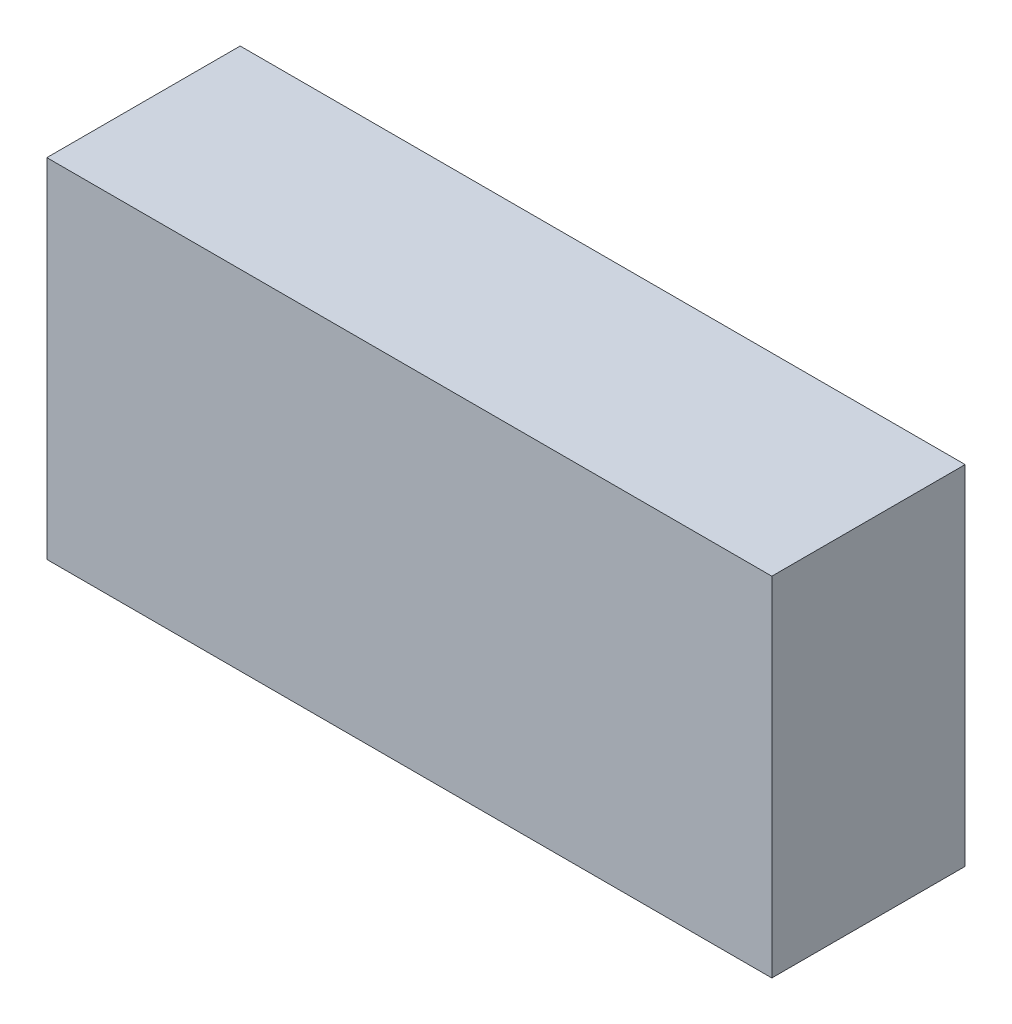
ISO-10303-21;
HEADER;
FILE_DESCRIPTION(('STEP AP214'),'2;1');
FILE_NAME('part.step','',(''),(''),'','','');
FILE_SCHEMA(('AUTOMOTIVE_DESIGN { 1 0 10303 214 1 1 1 1 }'));
ENDSEC;
DATA;
#1=APPLICATION_CONTEXT('core data for automotive mechanical design processes');
#2=APPLICATION_PROTOCOL_DEFINITION('international standard','automotive_design',2000,#1);
#3=PRODUCT_CONTEXT('',#1,'mechanical');
#4=PRODUCT('Part','Part','',(#3));
#5=PRODUCT_RELATED_PRODUCT_CATEGORY('part','',(#4));
#6=PRODUCT_DEFINITION_FORMATION('','',#4);
#7=PRODUCT_DEFINITION_CONTEXT('part definition',#1,'design');
#8=PRODUCT_DEFINITION('design','',#6,#7);
#9=PRODUCT_DEFINITION_SHAPE('','',#8);
#10=(LENGTH_UNIT() NAMED_UNIT(*) SI_UNIT(.MILLI.,.METRE.));
#11=(NAMED_UNIT(*) PLANE_ANGLE_UNIT() SI_UNIT($,.RADIAN.));
#12=(NAMED_UNIT(*) SI_UNIT($,.STERADIAN.) SOLID_ANGLE_UNIT());
#13=UNCERTAINTY_MEASURE_WITH_UNIT(LENGTH_MEASURE(1.E-05),#10,'distance_accuracy_value','');
#14=(GEOMETRIC_REPRESENTATION_CONTEXT(3) GLOBAL_UNCERTAINTY_ASSIGNED_CONTEXT((#13)) GLOBAL_UNIT_ASSIGNED_CONTEXT((#10,
#11,#12)) REPRESENTATION_CONTEXT('',''));
#15=CARTESIAN_POINT('',(0.,0.,0.));
#16=DIRECTION('',(0.,0.,1.));
#17=DIRECTION('',(1.,0.,0.));
#18=AXIS2_PLACEMENT_3D('',#15,#16,#17);
#19=CARTESIAN_POINT('',(-1.87500006,0.90000074,1.00000054));
#20=DIRECTION('',(0.,0.,-1.));
#21=DIRECTION('',(-1.,0.,0.));
#22=AXIS2_PLACEMENT_3D('',#19,#20,#21);
#23=PLANE('',#22);
#24=DIRECTION('',(1.,0.,0.));
#25=VECTOR('',#24,1.);
#26=CARTESIAN_POINT('',(-1.87500006,-0.8999982,1.00000054));
#27=LINE('',#26,#25);
#28=CARTESIAN_POINT('',(-1.87500006,-0.8999982,1.00000054));
#29=VERTEX_POINT('',#28);
#30=CARTESIAN_POINT('',(1.87500006,-0.8999982,1.00000054));
#31=VERTEX_POINT('',#30);
#32=EDGE_CURVE('E54',#29,#31,#27,.T.);
#33=ORIENTED_EDGE('',*,*,#32,.T.);
#34=DIRECTION('',(0.,1.,0.));
#35=VECTOR('',#34,1.);
#36=CARTESIAN_POINT('',(1.87500006,-0.8999982,1.00000054));
#37=LINE('',#36,#35);
#38=CARTESIAN_POINT('',(1.87500006,0.90000074,1.00000054));
#39=VERTEX_POINT('',#38);
#40=EDGE_CURVE('E56',#31,#39,#37,.T.);
#41=ORIENTED_EDGE('',*,*,#40,.T.);
#42=DIRECTION('',(1.,0.,0.));
#43=VECTOR('',#42,1.);
#44=CARTESIAN_POINT('',(1.87500006,0.90000074,1.00000054));
#45=LINE('',#44,#43);
#46=CARTESIAN_POINT('',(-1.87500006,0.90000074,1.00000054));
#47=VERTEX_POINT('',#46);
#48=EDGE_CURVE('E19',#39,#47,#45,.F.);
#49=ORIENTED_EDGE('',*,*,#48,.T.);
#50=DIRECTION('',(0.,1.,0.));
#51=VECTOR('',#50,1.);
#52=CARTESIAN_POINT('',(-1.87500006,0.90000074,1.00000054));
#53=LINE('',#52,#51);
#54=EDGE_CURVE('E79',#47,#29,#53,.F.);
#55=ORIENTED_EDGE('',*,*,#54,.T.);
#56=EDGE_LOOP('',(#33,#41,#49,#55));
#57=FACE_BOUND('',#56,.T.);
#58=ADVANCED_FACE('F16',(#57),#23,.F.);
#59=CARTESIAN_POINT('',(1.87500006,0.90000074,0.));
#60=DIRECTION('',(0.,-1.,0.));
#61=DIRECTION('',(0.,0.,-1.));
#62=AXIS2_PLACEMENT_3D('',#59,#60,#61);
#63=PLANE('',#62);
#64=DIRECTION('',(0.,0.,-1.));
#65=VECTOR('',#64,1.);
#66=CARTESIAN_POINT('',(-1.87500006,0.90000074,0.));
#67=LINE('',#66,#65);
#68=CARTESIAN_POINT('',(-1.87500006,0.90000074,0.));
#69=VERTEX_POINT('',#68);
#70=EDGE_CURVE('E67',#69,#47,#67,.F.);
#71=ORIENTED_EDGE('',*,*,#70,.T.);
#72=ORIENTED_EDGE('',*,*,#48,.F.);
#73=DIRECTION('',(0.,0.,1.));
#74=VECTOR('',#73,1.);
#75=CARTESIAN_POINT('',(1.87500006,0.90000074,0.));
#76=LINE('',#75,#74);
#77=CARTESIAN_POINT('',(1.87500006,0.90000074,0.));
#78=VERTEX_POINT('',#77);
#79=EDGE_CURVE('E62',#39,#78,#76,.F.);
#80=ORIENTED_EDGE('',*,*,#79,.T.);
#81=DIRECTION('',(-1.,0.,0.));
#82=VECTOR('',#81,1.);
#83=CARTESIAN_POINT('',(-1.87500006,0.90000074,0.));
#84=LINE('',#83,#82);
#85=EDGE_CURVE('E82',#69,#78,#84,.F.);
#86=ORIENTED_EDGE('',*,*,#85,.F.);
#87=EDGE_LOOP('',(#71,#72,#80,#86));
#88=FACE_BOUND('',#87,.T.);
#89=ADVANCED_FACE('F64',(#88),#63,.F.);
#90=CARTESIAN_POINT('',(1.87500006,-0.8999982,0.));
#91=DIRECTION('',(-1.,0.,0.));
#92=DIRECTION('',(0.,0.,1.));
#93=AXIS2_PLACEMENT_3D('',#90,#91,#92);
#94=PLANE('',#93);
#95=ORIENTED_EDGE('',*,*,#79,.F.);
#96=ORIENTED_EDGE('',*,*,#40,.F.);
#97=DIRECTION('',(0.,0.,1.));
#98=VECTOR('',#97,1.);
#99=CARTESIAN_POINT('',(1.87500006,-0.8999982,0.));
#100=LINE('',#99,#98);
#101=CARTESIAN_POINT('',(1.87500006,-0.8999982,0.));
#102=VERTEX_POINT('',#101);
#103=EDGE_CURVE('E74',#31,#102,#100,.F.);
#104=ORIENTED_EDGE('',*,*,#103,.T.);
#105=DIRECTION('',(0.,1.,0.));
#106=VECTOR('',#105,1.);
#107=CARTESIAN_POINT('',(1.87500006,0.90000074,0.));
#108=LINE('',#107,#106);
#109=EDGE_CURVE('E71',#78,#102,#108,.F.);
#110=ORIENTED_EDGE('',*,*,#109,.F.);
#111=EDGE_LOOP('',(#95,#96,#104,#110));
#112=FACE_BOUND('',#111,.T.);
#113=ADVANCED_FACE('F69',(#112),#94,.F.);
#114=CARTESIAN_POINT('',(-1.87500006,-0.8999982,0.));
#115=DIRECTION('',(0.,1.,0.));
#116=DIRECTION('',(0.,0.,1.));
#117=AXIS2_PLACEMENT_3D('',#114,#115,#116);
#118=PLANE('',#117);
#119=ORIENTED_EDGE('',*,*,#103,.F.);
#120=ORIENTED_EDGE('',*,*,#32,.F.);
#121=DIRECTION('',(0.,0.,-1.));
#122=VECTOR('',#121,1.);
#123=CARTESIAN_POINT('',(-1.87500006,-0.8999982,0.));
#124=LINE('',#123,#122);
#125=CARTESIAN_POINT('',(-1.87500006,-0.8999982,0.));
#126=VERTEX_POINT('',#125);
#127=EDGE_CURVE('E34',#29,#126,#124,.T.);
#128=ORIENTED_EDGE('',*,*,#127,.T.);
#129=DIRECTION('',(-1.,0.,0.));
#130=VECTOR('',#129,1.);
#131=CARTESIAN_POINT('',(-1.87500006,-0.8999982,0.));
#132=LINE('',#131,#130);
#133=EDGE_CURVE('E25',#102,#126,#132,.T.);
#134=ORIENTED_EDGE('',*,*,#133,.F.);
#135=EDGE_LOOP('',(#119,#120,#128,#134));
#136=FACE_BOUND('',#135,.T.);
#137=ADVANCED_FACE('F88',(#136),#118,.F.);
#138=CARTESIAN_POINT('',(-1.87500006,0.90000074,0.));
#139=DIRECTION('',(1.,0.,0.));
#140=DIRECTION('',(0.,0.,-1.));
#141=AXIS2_PLACEMENT_3D('',#138,#139,#140);
#142=PLANE('',#141);
#143=ORIENTED_EDGE('',*,*,#127,.F.);
#144=ORIENTED_EDGE('',*,*,#54,.F.);
#145=ORIENTED_EDGE('',*,*,#70,.F.);
#146=DIRECTION('',(0.,1.,0.));
#147=VECTOR('',#146,1.);
#148=CARTESIAN_POINT('',(-1.87500006,0.90000074,0.));
#149=LINE('',#148,#147);
#150=EDGE_CURVE('E11',#126,#69,#149,.T.);
#151=ORIENTED_EDGE('',*,*,#150,.F.);
#152=EDGE_LOOP('',(#143,#144,#145,#151));
#153=FACE_BOUND('',#152,.T.);
#154=ADVANCED_FACE('F90',(#153),#142,.F.);
#155=CARTESIAN_POINT('',(-1.87500006,0.90000074,0.));
#156=DIRECTION('',(0.,0.,-1.));
#157=DIRECTION('',(-1.,0.,0.));
#158=AXIS2_PLACEMENT_3D('',#155,#156,#157);
#159=PLANE('',#158);
#160=ORIENTED_EDGE('',*,*,#133,.T.);
#161=ORIENTED_EDGE('',*,*,#150,.T.);
#162=ORIENTED_EDGE('',*,*,#85,.T.);
#163=ORIENTED_EDGE('',*,*,#109,.T.);
#164=EDGE_LOOP('',(#160,#161,#162,#163));
#165=FACE_BOUND('',#164,.T.);
#166=ADVANCED_FACE('F87',(#165),#159,.T.);
#167=CLOSED_SHELL('',(#58,#89,#113,#137,#154,#166));
#168=MANIFOLD_SOLID_BREP('B1',#167);
#169=ADVANCED_BREP_SHAPE_REPRESENTATION('',(#18,#168),#14);
#170=SHAPE_DEFINITION_REPRESENTATION(#9,#169);
ENDSEC;
END-ISO-10303-21;
